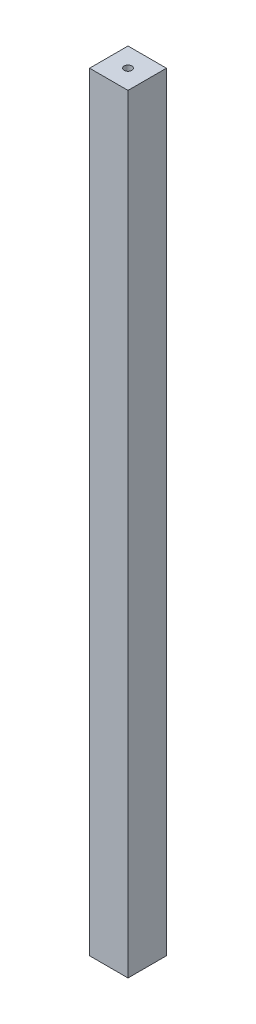
ISO-10303-21;
HEADER;
FILE_DESCRIPTION(('STEP AP214'),'2;1');
FILE_NAME('part.step','',(''),(''),'','','');
FILE_SCHEMA(('AUTOMOTIVE_DESIGN { 1 0 10303 214 1 1 1 1 }'));
ENDSEC;
DATA;
#1=APPLICATION_CONTEXT('core data for automotive mechanical design processes');
#2=APPLICATION_PROTOCOL_DEFINITION('international standard','automotive_design',2000,#1);
#3=PRODUCT_CONTEXT('',#1,'mechanical');
#4=PRODUCT('Part','Part','',(#3));
#5=PRODUCT_RELATED_PRODUCT_CATEGORY('part','',(#4));
#6=PRODUCT_DEFINITION_FORMATION('','',#4);
#7=PRODUCT_DEFINITION_CONTEXT('part definition',#1,'design');
#8=PRODUCT_DEFINITION('design','',#6,#7);
#9=PRODUCT_DEFINITION_SHAPE('','',#8);
#10=(LENGTH_UNIT() NAMED_UNIT(*) SI_UNIT(.MILLI.,.METRE.));
#11=(NAMED_UNIT(*) PLANE_ANGLE_UNIT() SI_UNIT($,.RADIAN.));
#12=(NAMED_UNIT(*) SI_UNIT($,.STERADIAN.) SOLID_ANGLE_UNIT());
#13=UNCERTAINTY_MEASURE_WITH_UNIT(LENGTH_MEASURE(1.E-05),#10,'distance_accuracy_value','');
#14=(GEOMETRIC_REPRESENTATION_CONTEXT(3) GLOBAL_UNCERTAINTY_ASSIGNED_CONTEXT((#13)) GLOBAL_UNIT_ASSIGNED_CONTEXT((#10,
#11,#12)) REPRESENTATION_CONTEXT('',''));
#15=CARTESIAN_POINT('',(0.,0.,0.));
#16=DIRECTION('',(0.,0.,1.));
#17=DIRECTION('',(1.,0.,0.));
#18=AXIS2_PLACEMENT_3D('',#15,#16,#17);
#19=CARTESIAN_POINT('',(0.,50.,0.));
#20=DIRECTION('',(0.,-1.,0.));
#21=DIRECTION('',(0.,0.,-1.));
#22=AXIS2_PLACEMENT_3D('',#19,#20,#21);
#23=PLANE('',#22);
#24=CARTESIAN_POINT('',(0.,50.,0.));
#25=DIRECTION('',(0.,-1.,0.));
#26=DIRECTION('',(0.,0.,-1.));
#27=AXIS2_PLACEMENT_3D('',#24,#25,#26);
#28=CIRCLE('',#27,5.);
#29=CARTESIAN_POINT('',(0.,50.,-5.));
#30=VERTEX_POINT('',#29);
#31=EDGE_CURVE('E115',#30,#30,#28,.T.);
#32=ORIENTED_EDGE('',*,*,#31,.T.);
#33=EDGE_LOOP('',(#32));
#34=FACE_BOUND('',#33,.T.);
#35=ADVANCED_FACE('F43',(#34),#23,.T.);
#36=CARTESIAN_POINT('',(0.,50.,0.));
#37=DIRECTION('',(0.,-1.,0.));
#38=DIRECTION('',(0.,0.,-1.));
#39=AXIS2_PLACEMENT_3D('',#36,#37,#38);
#40=CYLINDRICAL_SURFACE('',#39,5.);
#41=ORIENTED_EDGE('',*,*,#31,.F.);
#42=EDGE_LOOP('',(#41));
#43=FACE_BOUND('',#42,.T.);
#44=CARTESIAN_POINT('',(0.,-100.,0.));
#45=DIRECTION('',(0.,-1.,0.));
#46=DIRECTION('',(0.,0.,-1.));
#47=AXIS2_PLACEMENT_3D('',#44,#45,#46);
#48=CIRCLE('',#47,5.);
#49=CARTESIAN_POINT('',(0.,-100.,-5.));
#50=VERTEX_POINT('',#49);
#51=EDGE_CURVE('E105',#50,#50,#48,.T.);
#52=ORIENTED_EDGE('',*,*,#51,.T.);
#53=EDGE_LOOP('',(#52));
#54=FACE_BOUND('',#53,.T.);
#55=ADVANCED_FACE('F159',(#43,#54),#40,.F.);
#56=CARTESIAN_POINT('',(25.,900.,-25.));
#57=DIRECTION('',(0.,0.,1.));
#58=DIRECTION('',(1.,0.,0.));
#59=AXIS2_PLACEMENT_3D('',#56,#57,#58);
#60=PLANE('',#59);
#61=DIRECTION('',(0.,-1.,0.));
#62=VECTOR('',#61,1.);
#63=CARTESIAN_POINT('',(25.,900.,-25.));
#64=LINE('',#63,#62);
#65=CARTESIAN_POINT('',(25.,900.,-25.));
#66=VERTEX_POINT('',#65);
#67=CARTESIAN_POINT('',(25.,-100.,-25.));
#68=VERTEX_POINT('',#67);
#69=EDGE_CURVE('E59',#66,#68,#64,.T.);
#70=ORIENTED_EDGE('',*,*,#69,.T.);
#71=DIRECTION('',(1.,0.,0.));
#72=VECTOR('',#71,1.);
#73=CARTESIAN_POINT('',(-25.,-100.,-25.));
#74=LINE('',#73,#72);
#75=CARTESIAN_POINT('',(-25.,-100.,-25.));
#76=VERTEX_POINT('',#75);
#77=EDGE_CURVE('E95',#76,#68,#74,.T.);
#78=ORIENTED_EDGE('',*,*,#77,.F.);
#79=DIRECTION('',(0.,-1.,0.));
#80=VECTOR('',#79,1.);
#81=CARTESIAN_POINT('',(-25.,900.,-25.));
#82=LINE('',#81,#80);
#83=CARTESIAN_POINT('',(-25.,900.,-25.));
#84=VERTEX_POINT('',#83);
#85=EDGE_CURVE('E11',#84,#76,#82,.T.);
#86=ORIENTED_EDGE('',*,*,#85,.F.);
#87=DIRECTION('',(-1.,0.,0.));
#88=VECTOR('',#87,1.);
#89=CARTESIAN_POINT('',(25.,900.,-25.));
#90=LINE('',#89,#88);
#91=EDGE_CURVE('E124',#66,#84,#90,.T.);
#92=ORIENTED_EDGE('',*,*,#91,.F.);
#93=EDGE_LOOP('',(#70,#78,#86,#92));
#94=FACE_BOUND('',#93,.T.);
#95=ADVANCED_FACE('F45',(#94),#60,.F.);
#96=CARTESIAN_POINT('',(-25.,900.,-25.));
#97=DIRECTION('',(1.,0.,0.));
#98=DIRECTION('',(0.,0.,-1.));
#99=AXIS2_PLACEMENT_3D('',#96,#97,#98);
#100=PLANE('',#99);
#101=ORIENTED_EDGE('',*,*,#85,.T.);
#102=DIRECTION('',(0.,0.,-1.));
#103=VECTOR('',#102,1.);
#104=CARTESIAN_POINT('',(-25.,-100.,25.));
#105=LINE('',#104,#103);
#106=CARTESIAN_POINT('',(-25.,-100.,25.));
#107=VERTEX_POINT('',#106);
#108=EDGE_CURVE('E90',#107,#76,#105,.T.);
#109=ORIENTED_EDGE('',*,*,#108,.F.);
#110=DIRECTION('',(0.,-1.,0.));
#111=VECTOR('',#110,1.);
#112=CARTESIAN_POINT('',(-25.,900.,25.));
#113=LINE('',#112,#111);
#114=CARTESIAN_POINT('',(-25.,900.,25.));
#115=VERTEX_POINT('',#114);
#116=EDGE_CURVE('E52',#115,#107,#113,.T.);
#117=ORIENTED_EDGE('',*,*,#116,.F.);
#118=DIRECTION('',(0.,0.,1.));
#119=VECTOR('',#118,1.);
#120=CARTESIAN_POINT('',(-25.,900.,-25.));
#121=LINE('',#120,#119);
#122=EDGE_CURVE('E91',#84,#115,#121,.T.);
#123=ORIENTED_EDGE('',*,*,#122,.F.);
#124=EDGE_LOOP('',(#101,#109,#117,#123));
#125=FACE_BOUND('',#124,.T.);
#126=ADVANCED_FACE('F87',(#125),#100,.F.);
#127=CARTESIAN_POINT('',(25.,900.,25.));
#128=DIRECTION('',(0.,0.,1.));
#129=DIRECTION('',(1.,0.,0.));
#130=AXIS2_PLACEMENT_3D('',#127,#128,#129);
#131=PLANE('',#130);
#132=ORIENTED_EDGE('',*,*,#116,.T.);
#133=DIRECTION('',(-1.,0.,0.));
#134=VECTOR('',#133,1.);
#135=CARTESIAN_POINT('',(25.,-100.,25.));
#136=LINE('',#135,#134);
#137=CARTESIAN_POINT('',(25.,-100.,25.));
#138=VERTEX_POINT('',#137);
#139=EDGE_CURVE('E103',#138,#107,#136,.T.);
#140=ORIENTED_EDGE('',*,*,#139,.F.);
#141=DIRECTION('',(0.,-1.,0.));
#142=VECTOR('',#141,1.);
#143=CARTESIAN_POINT('',(25.,900.,25.));
#144=LINE('',#143,#142);
#145=CARTESIAN_POINT('',(25.,900.,25.));
#146=VERTEX_POINT('',#145);
#147=EDGE_CURVE('E67',#146,#138,#144,.T.);
#148=ORIENTED_EDGE('',*,*,#147,.F.);
#149=DIRECTION('',(-1.,0.,0.));
#150=VECTOR('',#149,1.);
#151=CARTESIAN_POINT('',(25.,900.,25.));
#152=LINE('',#151,#150);
#153=EDGE_CURVE('E132',#146,#115,#152,.T.);
#154=ORIENTED_EDGE('',*,*,#153,.T.);
#155=EDGE_LOOP('',(#132,#140,#148,#154));
#156=FACE_BOUND('',#155,.T.);
#157=ADVANCED_FACE('F142',(#156),#131,.T.);
#158=CARTESIAN_POINT('',(25.,900.,-25.));
#159=DIRECTION('',(1.,0.,0.));
#160=DIRECTION('',(0.,0.,-1.));
#161=AXIS2_PLACEMENT_3D('',#158,#159,#160);
#162=PLANE('',#161);
#163=ORIENTED_EDGE('',*,*,#147,.T.);
#164=DIRECTION('',(0.,0.,1.));
#165=VECTOR('',#164,1.);
#166=CARTESIAN_POINT('',(25.,-100.,-25.));
#167=LINE('',#166,#165);
#168=EDGE_CURVE('E99',#68,#138,#167,.T.);
#169=ORIENTED_EDGE('',*,*,#168,.F.);
#170=ORIENTED_EDGE('',*,*,#69,.F.);
#171=DIRECTION('',(0.,0.,1.));
#172=VECTOR('',#171,1.);
#173=CARTESIAN_POINT('',(25.,900.,-25.));
#174=LINE('',#173,#172);
#175=EDGE_CURVE('E135',#66,#146,#174,.T.);
#176=ORIENTED_EDGE('',*,*,#175,.T.);
#177=EDGE_LOOP('',(#163,#169,#170,#176));
#178=FACE_BOUND('',#177,.T.);
#179=ADVANCED_FACE('F146',(#178),#162,.T.);
#180=CARTESIAN_POINT('',(0.,900.,0.));
#181=DIRECTION('',(0.,1.,0.));
#182=DIRECTION('',(0.,0.,1.));
#183=AXIS2_PLACEMENT_3D('',#180,#181,#182);
#184=PLANE('',#183);
#185=CARTESIAN_POINT('',(0.,900.,0.));
#186=DIRECTION('',(0.,1.,0.));
#187=DIRECTION('',(0.,0.,1.));
#188=AXIS2_PLACEMENT_3D('',#185,#186,#187);
#189=CIRCLE('',#188,5.);
#190=CARTESIAN_POINT('',(0.,900.,5.));
#191=VERTEX_POINT('',#190);
#192=EDGE_CURVE('E119',#191,#191,#189,.T.);
#193=ORIENTED_EDGE('',*,*,#192,.F.);
#194=EDGE_LOOP('',(#193));
#195=FACE_BOUND('',#194,.T.);
#196=ORIENTED_EDGE('',*,*,#91,.T.);
#197=ORIENTED_EDGE('',*,*,#122,.T.);
#198=ORIENTED_EDGE('',*,*,#153,.F.);
#199=ORIENTED_EDGE('',*,*,#175,.F.);
#200=EDGE_LOOP('',(#196,#197,#198,#199));
#201=FACE_BOUND('',#200,.T.);
#202=ADVANCED_FACE('F145',(#195,#201),#184,.T.);
#203=CARTESIAN_POINT('',(0.,850.,0.));
#204=DIRECTION('',(0.,1.,0.));
#205=DIRECTION('',(0.,0.,1.));
#206=AXIS2_PLACEMENT_3D('',#203,#204,#205);
#207=CYLINDRICAL_SURFACE('',#206,5.);
#208=CARTESIAN_POINT('',(0.,850.,0.));
#209=DIRECTION('',(0.,1.,0.));
#210=DIRECTION('',(0.,0.,1.));
#211=AXIS2_PLACEMENT_3D('',#208,#209,#210);
#212=CIRCLE('',#211,5.);
#213=CARTESIAN_POINT('',(0.,850.,5.));
#214=VERTEX_POINT('',#213);
#215=EDGE_CURVE('E120',#214,#214,#212,.T.);
#216=ORIENTED_EDGE('',*,*,#215,.F.);
#217=EDGE_LOOP('',(#216));
#218=FACE_BOUND('',#217,.T.);
#219=ORIENTED_EDGE('',*,*,#192,.T.);
#220=EDGE_LOOP('',(#219));
#221=FACE_BOUND('',#220,.T.);
#222=ADVANCED_FACE('F154',(#218,#221),#207,.F.);
#223=CARTESIAN_POINT('',(0.,850.,0.));
#224=DIRECTION('',(0.,1.,0.));
#225=DIRECTION('',(0.,0.,1.));
#226=AXIS2_PLACEMENT_3D('',#223,#224,#225);
#227=PLANE('',#226);
#228=ORIENTED_EDGE('',*,*,#215,.T.);
#229=EDGE_LOOP('',(#228));
#230=FACE_BOUND('',#229,.T.);
#231=ADVANCED_FACE('F170',(#230),#227,.T.);
#232=CARTESIAN_POINT('',(0.,-100.,0.));
#233=DIRECTION('',(0.,-1.,0.));
#234=DIRECTION('',(0.,0.,-1.));
#235=AXIS2_PLACEMENT_3D('',#232,#233,#234);
#236=PLANE('',#235);
#237=ORIENTED_EDGE('',*,*,#51,.F.);
#238=EDGE_LOOP('',(#237));
#239=FACE_BOUND('',#238,.T.);
#240=ORIENTED_EDGE('',*,*,#108,.T.);
#241=ORIENTED_EDGE('',*,*,#77,.T.);
#242=ORIENTED_EDGE('',*,*,#168,.T.);
#243=ORIENTED_EDGE('',*,*,#139,.T.);
#244=EDGE_LOOP('',(#240,#241,#242,#243));
#245=FACE_BOUND('',#244,.T.);
#246=ADVANCED_FACE('F102',(#239,#245),#236,.T.);
#247=CLOSED_SHELL('',(#35,#55,#95,#126,#157,#179,#202,#222,#231,#246));
#248=MANIFOLD_SOLID_BREP('B2',#247);
#249=ADVANCED_BREP_SHAPE_REPRESENTATION('',(#18,#248),#14);
#250=SHAPE_DEFINITION_REPRESENTATION(#9,#249);
ENDSEC;
END-ISO-10303-21;
